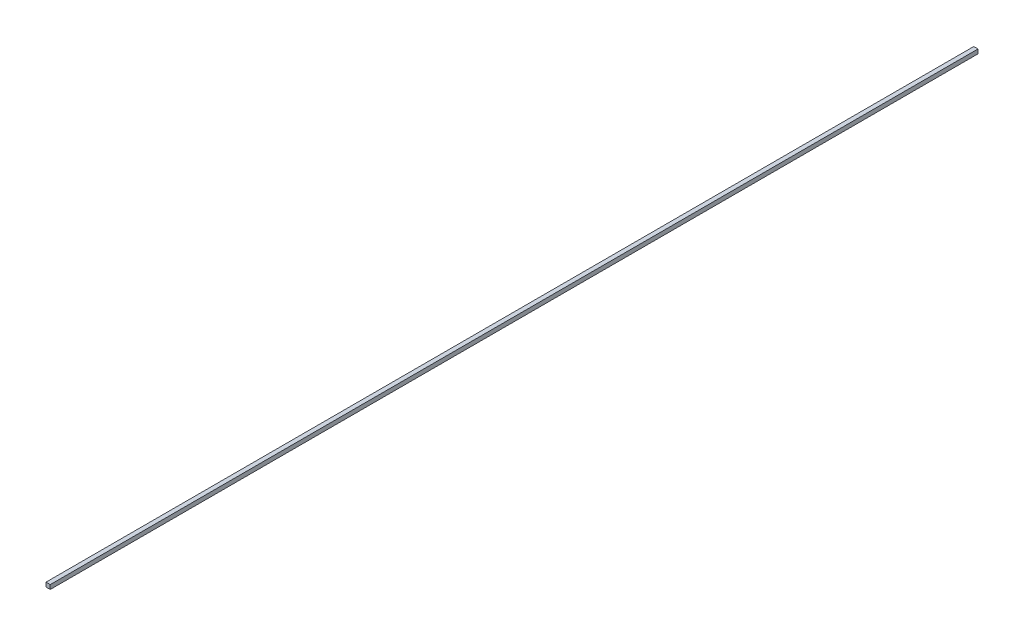
ISO-10303-21;
HEADER;
FILE_DESCRIPTION(('STEP AP214'),'2;1');
FILE_NAME('part.step','',(''),(''),'','','');
FILE_SCHEMA(('AUTOMOTIVE_DESIGN { 1 0 10303 214 1 1 1 1 }'));
ENDSEC;
DATA;
#1=APPLICATION_CONTEXT('core data for automotive mechanical design processes');
#2=APPLICATION_PROTOCOL_DEFINITION('international standard','automotive_design',2000,#1);
#3=PRODUCT_CONTEXT('',#1,'mechanical');
#4=PRODUCT('Part','Part','',(#3));
#5=PRODUCT_RELATED_PRODUCT_CATEGORY('part','',(#4));
#6=PRODUCT_DEFINITION_FORMATION('','',#4);
#7=PRODUCT_DEFINITION_CONTEXT('part definition',#1,'design');
#8=PRODUCT_DEFINITION('design','',#6,#7);
#9=PRODUCT_DEFINITION_SHAPE('','',#8);
#10=(LENGTH_UNIT() NAMED_UNIT(*) SI_UNIT(.MILLI.,.METRE.));
#11=(NAMED_UNIT(*) PLANE_ANGLE_UNIT() SI_UNIT($,.RADIAN.));
#12=(NAMED_UNIT(*) SI_UNIT($,.STERADIAN.) SOLID_ANGLE_UNIT());
#13=UNCERTAINTY_MEASURE_WITH_UNIT(LENGTH_MEASURE(1.E-05),#10,'distance_accuracy_value','');
#14=(GEOMETRIC_REPRESENTATION_CONTEXT(3) GLOBAL_UNCERTAINTY_ASSIGNED_CONTEXT((#13)) GLOBAL_UNIT_ASSIGNED_CONTEXT((#10,
#11,#12)) REPRESENTATION_CONTEXT('',''));
#15=CARTESIAN_POINT('',(0.,0.,0.));
#16=DIRECTION('',(0.,0.,1.));
#17=DIRECTION('',(1.,0.,0.));
#18=AXIS2_PLACEMENT_3D('',#15,#16,#17);
#19=CARTESIAN_POINT('',(0.,0.,655.));
#20=DIRECTION('',(1.,0.,0.));
#21=DIRECTION('',(0.,0.,-1.));
#22=AXIS2_PLACEMENT_3D('',#19,#20,#21);
#23=PLANE('',#22);
#24=DIRECTION('',(0.,-1.,0.));
#25=VECTOR('',#24,1.);
#26=CARTESIAN_POINT('',(0.,0.,0.));
#27=LINE('',#26,#25);
#28=CARTESIAN_POINT('',(0.,3.,0.));
#29=VERTEX_POINT('',#28);
#30=CARTESIAN_POINT('',(0.,0.,0.));
#31=VERTEX_POINT('',#30);
#32=EDGE_CURVE('E99',#29,#31,#27,.T.);
#33=ORIENTED_EDGE('',*,*,#32,.T.);
#34=DIRECTION('',(0.,0.,-1.));
#35=VECTOR('',#34,1.);
#36=CARTESIAN_POINT('',(0.,0.,655.));
#37=LINE('',#36,#35);
#38=CARTESIAN_POINT('',(0.,0.,655.));
#39=VERTEX_POINT('',#38);
#40=EDGE_CURVE('E11',#39,#31,#37,.T.);
#41=ORIENTED_EDGE('',*,*,#40,.F.);
#42=DIRECTION('',(0.,-1.,0.));
#43=VECTOR('',#42,1.);
#44=CARTESIAN_POINT('',(0.,0.,655.));
#45=LINE('',#44,#43);
#46=CARTESIAN_POINT('',(0.,3.,655.));
#47=VERTEX_POINT('',#46);
#48=EDGE_CURVE('E87',#47,#39,#45,.T.);
#49=ORIENTED_EDGE('',*,*,#48,.F.);
#50=DIRECTION('',(0.,0.,-1.));
#51=VECTOR('',#50,1.);
#52=CARTESIAN_POINT('',(0.,3.,655.));
#53=LINE('',#52,#51);
#54=EDGE_CURVE('E95',#47,#29,#53,.T.);
#55=ORIENTED_EDGE('',*,*,#54,.T.);
#56=EDGE_LOOP('',(#33,#41,#49,#55));
#57=FACE_BOUND('',#56,.T.);
#58=ADVANCED_FACE('F36',(#57),#23,.F.);
#59=CARTESIAN_POINT('',(0.,0.,655.));
#60=DIRECTION('',(0.,1.,0.));
#61=DIRECTION('',(0.,0.,1.));
#62=AXIS2_PLACEMENT_3D('',#59,#60,#61);
#63=PLANE('',#62);
#64=DIRECTION('',(1.,0.,0.));
#65=VECTOR('',#64,1.);
#66=CARTESIAN_POINT('',(0.,0.,0.));
#67=LINE('',#66,#65);
#68=CARTESIAN_POINT('',(3.,0.,0.));
#69=VERTEX_POINT('',#68);
#70=EDGE_CURVE('E91',#31,#69,#67,.T.);
#71=ORIENTED_EDGE('',*,*,#70,.T.);
#72=DIRECTION('',(0.,0.,-1.));
#73=VECTOR('',#72,1.);
#74=CARTESIAN_POINT('',(3.,0.,655.));
#75=LINE('',#74,#73);
#76=CARTESIAN_POINT('',(3.,0.,655.));
#77=VERTEX_POINT('',#76);
#78=EDGE_CURVE('E44',#77,#69,#75,.T.);
#79=ORIENTED_EDGE('',*,*,#78,.F.);
#80=DIRECTION('',(1.,0.,0.));
#81=VECTOR('',#80,1.);
#82=CARTESIAN_POINT('',(0.,0.,655.));
#83=LINE('',#82,#81);
#84=EDGE_CURVE('E82',#39,#77,#83,.T.);
#85=ORIENTED_EDGE('',*,*,#84,.F.);
#86=ORIENTED_EDGE('',*,*,#40,.T.);
#87=EDGE_LOOP('',(#71,#79,#85,#86));
#88=FACE_BOUND('',#87,.T.);
#89=ADVANCED_FACE('F90',(#88),#63,.F.);
#90=CARTESIAN_POINT('',(3.,0.,655.));
#91=DIRECTION('',(-1.,0.,0.));
#92=DIRECTION('',(0.,0.,1.));
#93=AXIS2_PLACEMENT_3D('',#90,#91,#92);
#94=PLANE('',#93);
#95=DIRECTION('',(0.,1.,0.));
#96=VECTOR('',#95,1.);
#97=CARTESIAN_POINT('',(3.,0.,0.));
#98=LINE('',#97,#96);
#99=CARTESIAN_POINT('',(3.,3.,0.));
#100=VERTEX_POINT('',#99);
#101=EDGE_CURVE('E69',#69,#100,#98,.T.);
#102=ORIENTED_EDGE('',*,*,#101,.T.);
#103=DIRECTION('',(0.,0.,-1.));
#104=VECTOR('',#103,1.);
#105=CARTESIAN_POINT('',(3.,3.,655.));
#106=LINE('',#105,#104);
#107=CARTESIAN_POINT('',(3.,3.,655.));
#108=VERTEX_POINT('',#107);
#109=EDGE_CURVE('E92',#108,#100,#106,.T.);
#110=ORIENTED_EDGE('',*,*,#109,.F.);
#111=DIRECTION('',(0.,1.,0.));
#112=VECTOR('',#111,1.);
#113=CARTESIAN_POINT('',(3.,0.,655.));
#114=LINE('',#113,#112);
#115=EDGE_CURVE('E85',#77,#108,#114,.T.);
#116=ORIENTED_EDGE('',*,*,#115,.F.);
#117=ORIENTED_EDGE('',*,*,#78,.T.);
#118=EDGE_LOOP('',(#102,#110,#116,#117));
#119=FACE_BOUND('',#118,.T.);
#120=ADVANCED_FACE('F93',(#119),#94,.F.);
#121=CARTESIAN_POINT('',(0.,3.,655.));
#122=DIRECTION('',(0.,-1.,0.));
#123=DIRECTION('',(0.,0.,-1.));
#124=AXIS2_PLACEMENT_3D('',#121,#122,#123);
#125=PLANE('',#124);
#126=DIRECTION('',(-1.,0.,0.));
#127=VECTOR('',#126,1.);
#128=CARTESIAN_POINT('',(0.,3.,0.));
#129=LINE('',#128,#127);
#130=EDGE_CURVE('E75',#100,#29,#129,.T.);
#131=ORIENTED_EDGE('',*,*,#130,.T.);
#132=ORIENTED_EDGE('',*,*,#54,.F.);
#133=DIRECTION('',(-1.,0.,0.));
#134=VECTOR('',#133,1.);
#135=CARTESIAN_POINT('',(0.,3.,655.));
#136=LINE('',#135,#134);
#137=EDGE_CURVE('E52',#108,#47,#136,.T.);
#138=ORIENTED_EDGE('',*,*,#137,.F.);
#139=ORIENTED_EDGE('',*,*,#109,.T.);
#140=EDGE_LOOP('',(#131,#132,#138,#139));
#141=FACE_BOUND('',#140,.T.);
#142=ADVANCED_FACE('F106',(#141),#125,.F.);
#143=CARTESIAN_POINT('',(0.,0.,655.));
#144=DIRECTION('',(0.,0.,-1.));
#145=DIRECTION('',(-1.,0.,0.));
#146=AXIS2_PLACEMENT_3D('',#143,#144,#145);
#147=PLANE('',#146);
#148=ORIENTED_EDGE('',*,*,#48,.T.);
#149=ORIENTED_EDGE('',*,*,#84,.T.);
#150=ORIENTED_EDGE('',*,*,#115,.T.);
#151=ORIENTED_EDGE('',*,*,#137,.T.);
#152=EDGE_LOOP('',(#148,#149,#150,#151));
#153=FACE_BOUND('',#152,.T.);
#154=ADVANCED_FACE('F83',(#153),#147,.F.);
#155=CARTESIAN_POINT('',(0.,0.,0.));
#156=DIRECTION('',(0.,0.,-1.));
#157=DIRECTION('',(-1.,0.,0.));
#158=AXIS2_PLACEMENT_3D('',#155,#156,#157);
#159=PLANE('',#158);
#160=ORIENTED_EDGE('',*,*,#32,.F.);
#161=ORIENTED_EDGE('',*,*,#130,.F.);
#162=ORIENTED_EDGE('',*,*,#101,.F.);
#163=ORIENTED_EDGE('',*,*,#70,.F.);
#164=EDGE_LOOP('',(#160,#161,#162,#163));
#165=FACE_BOUND('',#164,.T.);
#166=ADVANCED_FACE('F109',(#165),#159,.T.);
#167=CLOSED_SHELL('',(#58,#89,#120,#142,#154,#166));
#168=MANIFOLD_SOLID_BREP('B2',#167);
#169=ADVANCED_BREP_SHAPE_REPRESENTATION('',(#18,#168),#14);
#170=SHAPE_DEFINITION_REPRESENTATION(#9,#169);
ENDSEC;
END-ISO-10303-21;
